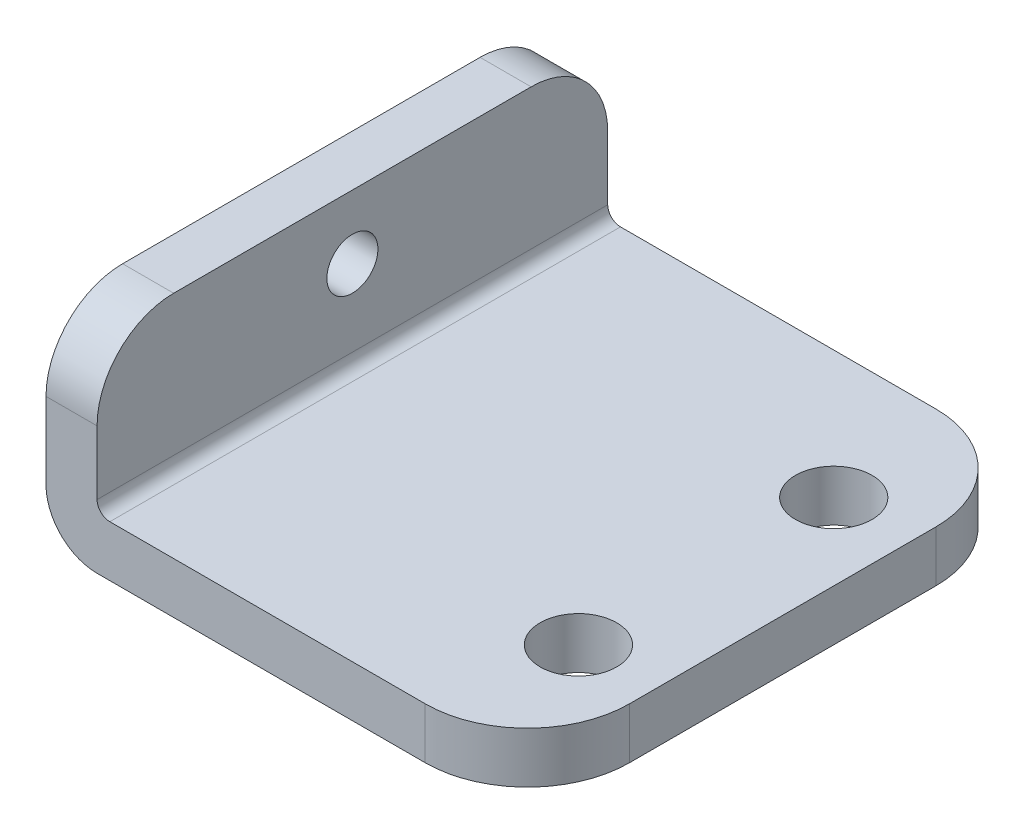
ISO-10303-21;
HEADER;
FILE_DESCRIPTION(('STEP AP214'),'2;1');
FILE_NAME('part.step','',(''),(''),'','','');
FILE_SCHEMA(('AUTOMOTIVE_DESIGN { 1 0 10303 214 1 1 1 1 }'));
ENDSEC;
DATA;
#1=APPLICATION_CONTEXT('core data for automotive mechanical design processes');
#2=APPLICATION_PROTOCOL_DEFINITION('international standard','automotive_design',2000,#1);
#3=PRODUCT_CONTEXT('',#1,'mechanical');
#4=PRODUCT('Part','Part','',(#3));
#5=PRODUCT_RELATED_PRODUCT_CATEGORY('part','',(#4));
#6=PRODUCT_DEFINITION_FORMATION('','',#4);
#7=PRODUCT_DEFINITION_CONTEXT('part definition',#1,'design');
#8=PRODUCT_DEFINITION('design','',#6,#7);
#9=PRODUCT_DEFINITION_SHAPE('','',#8);
#10=(LENGTH_UNIT() NAMED_UNIT(*) SI_UNIT(.MILLI.,.METRE.));
#11=(NAMED_UNIT(*) PLANE_ANGLE_UNIT() SI_UNIT($,.RADIAN.));
#12=(NAMED_UNIT(*) SI_UNIT($,.STERADIAN.) SOLID_ANGLE_UNIT());
#13=UNCERTAINTY_MEASURE_WITH_UNIT(LENGTH_MEASURE(1.E-05),#10,'distance_accuracy_value','');
#14=(GEOMETRIC_REPRESENTATION_CONTEXT(3) GLOBAL_UNCERTAINTY_ASSIGNED_CONTEXT((#13)) GLOBAL_UNIT_ASSIGNED_CONTEXT((#10,
#11,#12)) REPRESENTATION_CONTEXT('',''));
#15=CARTESIAN_POINT('',(0.,0.,0.));
#16=DIRECTION('',(0.,0.,1.));
#17=DIRECTION('',(1.,0.,0.));
#18=AXIS2_PLACEMENT_3D('',#15,#16,#17);
#19=CARTESIAN_POINT('',(8.42639593908629,2.,10.));
#20=DIRECTION('',(-1.,0.,0.));
#21=DIRECTION('',(0.,0.,1.));
#22=AXIS2_PLACEMENT_3D('',#19,#20,#21);
#23=PLANE('',#22);
#24=DIRECTION('',(0.,0.,-1.));
#25=VECTOR('',#24,1.);
#26=CARTESIAN_POINT('',(8.42639593908629,0.,10.));
#27=LINE('',#26,#25);
#28=CARTESIAN_POINT('',(8.42639593908629,0.,6.));
#29=VERTEX_POINT('',#28);
#30=CARTESIAN_POINT('',(8.42639593908629,0.,-6.));
#31=VERTEX_POINT('',#30);
#32=EDGE_CURVE('E152',#29,#31,#27,.T.);
#33=ORIENTED_EDGE('',*,*,#32,.T.);
#34=DIRECTION('',(0.,-1.,0.));
#35=VECTOR('',#34,1.);
#36=CARTESIAN_POINT('',(8.42639593908629,2.,-6.));
#37=LINE('',#36,#35);
#38=CARTESIAN_POINT('',(8.42639593908629,2.,-6.));
#39=VERTEX_POINT('',#38);
#40=EDGE_CURVE('E129',#31,#39,#37,.F.);
#41=ORIENTED_EDGE('',*,*,#40,.T.);
#42=DIRECTION('',(0.,0.,-1.));
#43=VECTOR('',#42,1.);
#44=CARTESIAN_POINT('',(8.42639593908629,2.,10.));
#45=LINE('',#44,#43);
#46=CARTESIAN_POINT('',(8.42639593908629,2.,6.));
#47=VERTEX_POINT('',#46);
#48=EDGE_CURVE('E154',#47,#39,#45,.T.);
#49=ORIENTED_EDGE('',*,*,#48,.F.);
#50=DIRECTION('',(0.,-1.,0.));
#51=VECTOR('',#50,1.);
#52=CARTESIAN_POINT('',(8.42639593908629,2.,6.));
#53=LINE('',#52,#51);
#54=EDGE_CURVE('E134',#47,#29,#53,.T.);
#55=ORIENTED_EDGE('',*,*,#54,.T.);
#56=EDGE_LOOP('',(#33,#41,#49,#55));
#57=FACE_BOUND('',#56,.T.);
#58=ADVANCED_FACE('F36',(#57),#23,.F.);
#59=CARTESIAN_POINT('',(-8.42639593908629,2.,-10.));
#60=DIRECTION('',(0.,0.,1.));
#61=DIRECTION('',(1.,0.,0.));
#62=AXIS2_PLACEMENT_3D('',#59,#60,#61);
#63=PLANE('',#62);
#64=DIRECTION('',(-1.,0.,0.));
#65=VECTOR('',#64,1.);
#66=CARTESIAN_POINT('',(-8.42639593908629,0.,-10.));
#67=LINE('',#66,#65);
#68=CARTESIAN_POINT('',(4.42639593908629,0.,-10.));
#69=VERTEX_POINT('',#68);
#70=CARTESIAN_POINT('',(-8.42639593908629,0.,-10.));
#71=VERTEX_POINT('',#70);
#72=EDGE_CURVE('E141',#69,#71,#67,.T.);
#73=ORIENTED_EDGE('',*,*,#72,.T.);
#74=CARTESIAN_POINT('',(-8.42639593908629,2.,-10.));
#75=DIRECTION('',(0.,0.,1.));
#76=DIRECTION('',(1.,0.,0.));
#77=AXIS2_PLACEMENT_3D('',#74,#75,#76);
#78=CIRCLE('',#77,2.);
#79=CARTESIAN_POINT('',(-10.4263959390863,2.,-10.));
#80=VERTEX_POINT('',#79);
#81=EDGE_CURVE('E198',#71,#80,#78,.F.);
#82=ORIENTED_EDGE('',*,*,#81,.T.);
#83=DIRECTION('',(0.,-1.,0.));
#84=VECTOR('',#83,1.);
#85=CARTESIAN_POINT('',(-10.4263959390863,0.,-10.));
#86=LINE('',#85,#84);
#87=CARTESIAN_POINT('',(-10.4263959390863,5.,-10.));
#88=VERTEX_POINT('',#87);
#89=EDGE_CURVE('E219',#88,#80,#86,.T.);
#90=ORIENTED_EDGE('',*,*,#89,.F.);
#91=DIRECTION('',(1.,0.,0.));
#92=VECTOR('',#91,1.);
#93=CARTESIAN_POINT('',(-8.42639593908629,5.,-10.));
#94=LINE('',#93,#92);
#95=CARTESIAN_POINT('',(-8.42639593908629,5.,-10.));
#96=VERTEX_POINT('',#95);
#97=EDGE_CURVE('E183',#88,#96,#94,.T.);
#98=ORIENTED_EDGE('',*,*,#97,.T.);
#99=DIRECTION('',(0.,-1.,0.));
#100=VECTOR('',#99,1.);
#101=CARTESIAN_POINT('',(-8.42639593908629,0.,-10.));
#102=LINE('',#101,#100);
#103=CARTESIAN_POINT('',(-8.42639593908629,2.5,-10.));
#104=VERTEX_POINT('',#103);
#105=EDGE_CURVE('E222',#96,#104,#102,.T.);
#106=ORIENTED_EDGE('',*,*,#105,.T.);
#107=CARTESIAN_POINT('',(-7.92639593908629,2.5,-10.));
#108=DIRECTION('',(0.,0.,1.));
#109=DIRECTION('',(1.,0.,0.));
#110=AXIS2_PLACEMENT_3D('',#107,#108,#109);
#111=CIRCLE('',#110,0.5);
#112=CARTESIAN_POINT('',(-7.92639593908629,2.,-10.));
#113=VERTEX_POINT('',#112);
#114=EDGE_CURVE('E11',#104,#113,#111,.T.);
#115=ORIENTED_EDGE('',*,*,#114,.T.);
#116=DIRECTION('',(-1.,0.,0.));
#117=VECTOR('',#116,1.);
#118=CARTESIAN_POINT('',(-8.42639593908629,2.,-10.));
#119=LINE('',#118,#117);
#120=CARTESIAN_POINT('',(4.42639593908629,2.,-10.));
#121=VERTEX_POINT('',#120);
#122=EDGE_CURVE('E144',#121,#113,#119,.T.);
#123=ORIENTED_EDGE('',*,*,#122,.F.);
#124=DIRECTION('',(0.,-1.,0.));
#125=VECTOR('',#124,1.);
#126=CARTESIAN_POINT('',(4.42639593908629,2.,-10.));
#127=LINE('',#126,#125);
#128=EDGE_CURVE('E128',#121,#69,#127,.T.);
#129=ORIENTED_EDGE('',*,*,#128,.T.);
#130=EDGE_LOOP('',(#73,#82,#90,#98,#106,#115,#123,#129));
#131=FACE_BOUND('',#130,.T.);
#132=ADVANCED_FACE('F140',(#131),#63,.F.);
#133=CARTESIAN_POINT('',(-8.42639593908629,2.,10.));
#134=DIRECTION('',(0.,0.,-1.));
#135=DIRECTION('',(-1.,0.,0.));
#136=AXIS2_PLACEMENT_3D('',#133,#134,#135);
#137=PLANE('',#136);
#138=DIRECTION('',(0.,1.,0.));
#139=VECTOR('',#138,1.);
#140=CARTESIAN_POINT('',(-10.4263959390863,0.,10.));
#141=LINE('',#140,#139);
#142=CARTESIAN_POINT('',(-10.4263959390863,2.,10.));
#143=VERTEX_POINT('',#142);
#144=CARTESIAN_POINT('',(-10.4263959390863,5.,10.));
#145=VERTEX_POINT('',#144);
#146=EDGE_CURVE('E227',#143,#145,#141,.T.);
#147=ORIENTED_EDGE('',*,*,#146,.F.);
#148=CARTESIAN_POINT('',(-8.42639593908629,2.,10.));
#149=DIRECTION('',(0.,0.,-1.));
#150=DIRECTION('',(-1.,0.,0.));
#151=AXIS2_PLACEMENT_3D('',#148,#149,#150);
#152=CIRCLE('',#151,2.);
#153=CARTESIAN_POINT('',(-8.42639593908629,0.,10.));
#154=VERTEX_POINT('',#153);
#155=EDGE_CURVE('E195',#143,#154,#152,.F.);
#156=ORIENTED_EDGE('',*,*,#155,.T.);
#157=DIRECTION('',(1.,0.,0.));
#158=VECTOR('',#157,1.);
#159=CARTESIAN_POINT('',(-8.42639593908629,0.,10.));
#160=LINE('',#159,#158);
#161=CARTESIAN_POINT('',(4.42639593908629,0.,10.));
#162=VERTEX_POINT('',#161);
#163=EDGE_CURVE('E151',#154,#162,#160,.T.);
#164=ORIENTED_EDGE('',*,*,#163,.T.);
#165=DIRECTION('',(0.,-1.,0.));
#166=VECTOR('',#165,1.);
#167=CARTESIAN_POINT('',(4.42639593908629,2.,10.));
#168=LINE('',#167,#166);
#169=CARTESIAN_POINT('',(4.42639593908629,2.,10.));
#170=VERTEX_POINT('',#169);
#171=EDGE_CURVE('E169',#162,#170,#168,.F.);
#172=ORIENTED_EDGE('',*,*,#171,.T.);
#173=DIRECTION('',(1.,0.,0.));
#174=VECTOR('',#173,1.);
#175=CARTESIAN_POINT('',(-8.42639593908629,2.,10.));
#176=LINE('',#175,#174);
#177=CARTESIAN_POINT('',(-7.92639593908629,2.,10.));
#178=VERTEX_POINT('',#177);
#179=EDGE_CURVE('E145',#178,#170,#176,.T.);
#180=ORIENTED_EDGE('',*,*,#179,.F.);
#181=CARTESIAN_POINT('',(-7.92639593908629,2.5,10.));
#182=DIRECTION('',(0.,0.,-1.));
#183=DIRECTION('',(-1.,0.,0.));
#184=AXIS2_PLACEMENT_3D('',#181,#182,#183);
#185=CIRCLE('',#184,0.5);
#186=CARTESIAN_POINT('',(-8.42639593908629,2.5,10.));
#187=VERTEX_POINT('',#186);
#188=EDGE_CURVE('E44',#178,#187,#185,.T.);
#189=ORIENTED_EDGE('',*,*,#188,.T.);
#190=DIRECTION('',(0.,1.,0.));
#191=VECTOR('',#190,1.);
#192=CARTESIAN_POINT('',(-8.42639593908629,0.,10.));
#193=LINE('',#192,#191);
#194=CARTESIAN_POINT('',(-8.42639593908629,5.,10.));
#195=VERTEX_POINT('',#194);
#196=EDGE_CURVE('E220',#187,#195,#193,.T.);
#197=ORIENTED_EDGE('',*,*,#196,.T.);
#198=DIRECTION('',(1.,0.,0.));
#199=VECTOR('',#198,1.);
#200=CARTESIAN_POINT('',(-8.42639593908629,5.,10.));
#201=LINE('',#200,#199);
#202=EDGE_CURVE('E178',#195,#145,#201,.F.);
#203=ORIENTED_EDGE('',*,*,#202,.T.);
#204=EDGE_LOOP('',(#147,#156,#164,#172,#180,#189,#197,#203));
#205=FACE_BOUND('',#204,.T.);
#206=ADVANCED_FACE('F209',(#205),#137,.F.);
#207=CARTESIAN_POINT('',(0.,2.,0.));
#208=DIRECTION('',(0.,-1.,0.));
#209=DIRECTION('',(0.,0.,-1.));
#210=AXIS2_PLACEMENT_3D('',#207,#208,#209);
#211=PLANE('',#210);
#212=CARTESIAN_POINT('',(5.42639593908629,2.,-5.));
#213=DIRECTION('',(0.,1.,0.));
#214=DIRECTION('',(0.,0.,1.));
#215=AXIS2_PLACEMENT_3D('',#212,#213,#214);
#216=CIRCLE('',#215,1.5);
#217=CARTESIAN_POINT('',(5.42639593908629,2.,-3.5));
#218=VERTEX_POINT('',#217);
#219=EDGE_CURVE('E243',#218,#218,#216,.T.);
#220=ORIENTED_EDGE('',*,*,#219,.F.);
#221=EDGE_LOOP('',(#220));
#222=FACE_BOUND('',#221,.T.);
#223=CARTESIAN_POINT('',(5.42639593908629,2.,5.));
#224=DIRECTION('',(0.,1.,0.));
#225=DIRECTION('',(0.,0.,1.));
#226=AXIS2_PLACEMENT_3D('',#223,#224,#225);
#227=CIRCLE('',#226,1.5);
#228=CARTESIAN_POINT('',(5.42639593908629,2.,6.5));
#229=VERTEX_POINT('',#228);
#230=EDGE_CURVE('E237',#229,#229,#227,.T.);
#231=ORIENTED_EDGE('',*,*,#230,.F.);
#232=EDGE_LOOP('',(#231));
#233=FACE_BOUND('',#232,.T.);
#234=ORIENTED_EDGE('',*,*,#122,.T.);
#235=DIRECTION('',(0.,0.,1.));
#236=VECTOR('',#235,1.);
#237=CARTESIAN_POINT('',(-7.92639593908629,2.,0.));
#238=LINE('',#237,#236);
#239=EDGE_CURVE('E200',#113,#178,#238,.T.);
#240=ORIENTED_EDGE('',*,*,#239,.T.);
#241=ORIENTED_EDGE('',*,*,#179,.T.);
#242=CARTESIAN_POINT('',(4.42639593908629,2.,6.));
#243=DIRECTION('',(0.,-1.,0.));
#244=DIRECTION('',(0.,0.,-1.));
#245=AXIS2_PLACEMENT_3D('',#242,#243,#244);
#246=CIRCLE('',#245,4.);
#247=EDGE_CURVE('E165',#170,#47,#246,.F.);
#248=ORIENTED_EDGE('',*,*,#247,.T.);
#249=ORIENTED_EDGE('',*,*,#48,.T.);
#250=CARTESIAN_POINT('',(4.42639593908629,2.,-6.));
#251=DIRECTION('',(0.,-1.,0.));
#252=DIRECTION('',(0.,0.,-1.));
#253=AXIS2_PLACEMENT_3D('',#250,#251,#252);
#254=CIRCLE('',#253,4.);
#255=EDGE_CURVE('E167',#39,#121,#254,.F.);
#256=ORIENTED_EDGE('',*,*,#255,.T.);
#257=EDGE_LOOP('',(#234,#240,#241,#248,#249,#256));
#258=FACE_BOUND('',#257,.T.);
#259=ADVANCED_FACE('F205',(#222,#233,#258),#211,.F.);
#260=CARTESIAN_POINT('',(0.,0.,0.));
#261=DIRECTION('',(0.,-1.,0.));
#262=DIRECTION('',(0.,0.,-1.));
#263=AXIS2_PLACEMENT_3D('',#260,#261,#262);
#264=PLANE('',#263);
#265=CARTESIAN_POINT('',(5.42639593908629,0.,-5.));
#266=DIRECTION('',(0.,1.,0.));
#267=DIRECTION('',(0.,0.,1.));
#268=AXIS2_PLACEMENT_3D('',#265,#266,#267);
#269=CIRCLE('',#268,1.5);
#270=CARTESIAN_POINT('',(5.42639593908629,0.,-3.5));
#271=VERTEX_POINT('',#270);
#272=EDGE_CURVE('E234',#271,#271,#269,.T.);
#273=ORIENTED_EDGE('',*,*,#272,.T.);
#274=EDGE_LOOP('',(#273));
#275=FACE_BOUND('',#274,.T.);
#276=CARTESIAN_POINT('',(5.42639593908629,0.,5.));
#277=DIRECTION('',(0.,1.,0.));
#278=DIRECTION('',(0.,0.,1.));
#279=AXIS2_PLACEMENT_3D('',#276,#277,#278);
#280=CIRCLE('',#279,1.5);
#281=CARTESIAN_POINT('',(5.42639593908629,0.,6.5));
#282=VERTEX_POINT('',#281);
#283=EDGE_CURVE('E240',#282,#282,#280,.T.);
#284=ORIENTED_EDGE('',*,*,#283,.T.);
#285=EDGE_LOOP('',(#284));
#286=FACE_BOUND('',#285,.T.);
#287=ORIENTED_EDGE('',*,*,#163,.F.);
#288=DIRECTION('',(0.,0.,1.));
#289=VECTOR('',#288,1.);
#290=CARTESIAN_POINT('',(-8.42639593908629,0.,-10.));
#291=LINE('',#290,#289);
#292=EDGE_CURVE('E150',#154,#71,#291,.F.);
#293=ORIENTED_EDGE('',*,*,#292,.T.);
#294=ORIENTED_EDGE('',*,*,#72,.F.);
#295=CARTESIAN_POINT('',(4.42639593908629,0.,-6.));
#296=DIRECTION('',(0.,-1.,0.));
#297=DIRECTION('',(0.,0.,-1.));
#298=AXIS2_PLACEMENT_3D('',#295,#296,#297);
#299=CIRCLE('',#298,4.);
#300=EDGE_CURVE('E124',#69,#31,#299,.T.);
#301=ORIENTED_EDGE('',*,*,#300,.T.);
#302=ORIENTED_EDGE('',*,*,#32,.F.);
#303=CARTESIAN_POINT('',(4.42639593908629,0.,6.));
#304=DIRECTION('',(0.,-1.,0.));
#305=DIRECTION('',(0.,0.,-1.));
#306=AXIS2_PLACEMENT_3D('',#303,#304,#305);
#307=CIRCLE('',#306,4.);
#308=EDGE_CURVE('E135',#29,#162,#307,.T.);
#309=ORIENTED_EDGE('',*,*,#308,.T.);
#310=EDGE_LOOP('',(#287,#293,#294,#301,#302,#309));
#311=FACE_BOUND('',#310,.T.);
#312=ADVANCED_FACE('F148',(#275,#286,#311),#264,.T.);
#313=CARTESIAN_POINT('',(4.42639593908629,2.,-6.));
#314=DIRECTION('',(0.,-1.,0.));
#315=DIRECTION('',(0.,0.,-1.));
#316=AXIS2_PLACEMENT_3D('',#313,#314,#315);
#317=CYLINDRICAL_SURFACE('',#316,4.);
#318=ORIENTED_EDGE('',*,*,#255,.F.);
#319=ORIENTED_EDGE('',*,*,#40,.F.);
#320=ORIENTED_EDGE('',*,*,#300,.F.);
#321=ORIENTED_EDGE('',*,*,#128,.F.);
#322=EDGE_LOOP('',(#318,#319,#320,#321));
#323=FACE_BOUND('',#322,.T.);
#324=ADVANCED_FACE('F127',(#323),#317,.T.);
#325=CARTESIAN_POINT('',(4.42639593908629,2.,6.));
#326=DIRECTION('',(0.,-1.,0.));
#327=DIRECTION('',(0.,0.,-1.));
#328=AXIS2_PLACEMENT_3D('',#325,#326,#327);
#329=CYLINDRICAL_SURFACE('',#328,4.);
#330=ORIENTED_EDGE('',*,*,#247,.F.);
#331=ORIENTED_EDGE('',*,*,#171,.F.);
#332=ORIENTED_EDGE('',*,*,#308,.F.);
#333=ORIENTED_EDGE('',*,*,#54,.F.);
#334=EDGE_LOOP('',(#330,#331,#332,#333));
#335=FACE_BOUND('',#334,.T.);
#336=ADVANCED_FACE('F283',(#335),#329,.T.);
#337=CARTESIAN_POINT('',(-8.42639593908629,0.,0.));
#338=DIRECTION('',(1.,0.,0.));
#339=DIRECTION('',(0.,0.,-1.));
#340=AXIS2_PLACEMENT_3D('',#337,#338,#339);
#341=PLANE('',#340);
#342=CARTESIAN_POINT('',(-8.42639593908629,5.5,0.));
#343=DIRECTION('',(-1.,0.,0.));
#344=DIRECTION('',(0.,0.,1.));
#345=AXIS2_PLACEMENT_3D('',#342,#343,#344);
#346=CIRCLE('',#345,1.);
#347=CARTESIAN_POINT('',(-8.42639593908629,5.5,0.999999999999999));
#348=VERTEX_POINT('',#347);
#349=EDGE_CURVE('E231',#348,#348,#346,.T.);
#350=ORIENTED_EDGE('',*,*,#349,.T.);
#351=EDGE_LOOP('',(#350));
#352=FACE_BOUND('',#351,.T.);
#353=ORIENTED_EDGE('',*,*,#196,.F.);
#354=DIRECTION('',(0.,0.,1.));
#355=VECTOR('',#354,1.);
#356=CARTESIAN_POINT('',(-8.42639593908629,2.5,0.));
#357=LINE('',#356,#355);
#358=EDGE_CURVE('E57',#187,#104,#357,.F.);
#359=ORIENTED_EDGE('',*,*,#358,.T.);
#360=ORIENTED_EDGE('',*,*,#105,.F.);
#361=CARTESIAN_POINT('',(-8.42639593908629,5.,-7.));
#362=DIRECTION('',(1.,0.,0.));
#363=DIRECTION('',(0.,0.,-1.));
#364=AXIS2_PLACEMENT_3D('',#361,#362,#363);
#365=CIRCLE('',#364,3.);
#366=CARTESIAN_POINT('',(-8.42639593908629,8.,-7.));
#367=VERTEX_POINT('',#366);
#368=EDGE_CURVE('E186',#96,#367,#365,.T.);
#369=ORIENTED_EDGE('',*,*,#368,.T.);
#370=DIRECTION('',(0.,0.,-1.));
#371=VECTOR('',#370,1.);
#372=CARTESIAN_POINT('',(-8.42639593908629,8.,-10.));
#373=LINE('',#372,#371);
#374=CARTESIAN_POINT('',(-8.42639593908629,8.,7.));
#375=VERTEX_POINT('',#374);
#376=EDGE_CURVE('E216',#375,#367,#373,.T.);
#377=ORIENTED_EDGE('',*,*,#376,.F.);
#378=CARTESIAN_POINT('',(-8.42639593908629,5.,7.));
#379=DIRECTION('',(1.,0.,0.));
#380=DIRECTION('',(0.,0.,-1.));
#381=AXIS2_PLACEMENT_3D('',#378,#379,#380);
#382=CIRCLE('',#381,3.);
#383=EDGE_CURVE('E175',#375,#195,#382,.T.);
#384=ORIENTED_EDGE('',*,*,#383,.T.);
#385=EDGE_LOOP('',(#353,#359,#360,#369,#377,#384));
#386=FACE_BOUND('',#385,.T.);
#387=ADVANCED_FACE('F286',(#352,#386),#341,.T.);
#388=CARTESIAN_POINT('',(-10.4263959390863,0.,0.));
#389=DIRECTION('',(1.,0.,0.));
#390=DIRECTION('',(0.,0.,-1.));
#391=AXIS2_PLACEMENT_3D('',#388,#389,#390);
#392=PLANE('',#391);
#393=ORIENTED_EDGE('',*,*,#89,.T.);
#394=DIRECTION('',(0.,0.,1.));
#395=VECTOR('',#394,1.);
#396=CARTESIAN_POINT('',(-10.4263959390863,2.,10.));
#397=LINE('',#396,#395);
#398=EDGE_CURVE('E192',#80,#143,#397,.T.);
#399=ORIENTED_EDGE('',*,*,#398,.T.);
#400=ORIENTED_EDGE('',*,*,#146,.T.);
#401=CARTESIAN_POINT('',(-10.4263959390863,5.,7.));
#402=DIRECTION('',(1.,0.,0.));
#403=DIRECTION('',(0.,0.,-1.));
#404=AXIS2_PLACEMENT_3D('',#401,#402,#403);
#405=CIRCLE('',#404,3.);
#406=CARTESIAN_POINT('',(-10.4263959390863,8.,7.));
#407=VERTEX_POINT('',#406);
#408=EDGE_CURVE('E181',#145,#407,#405,.F.);
#409=ORIENTED_EDGE('',*,*,#408,.T.);
#410=DIRECTION('',(0.,0.,-1.));
#411=VECTOR('',#410,1.);
#412=CARTESIAN_POINT('',(-10.4263959390863,8.,-10.));
#413=LINE('',#412,#411);
#414=CARTESIAN_POINT('',(-10.4263959390863,8.,-7.));
#415=VERTEX_POINT('',#414);
#416=EDGE_CURVE('E156',#407,#415,#413,.T.);
#417=ORIENTED_EDGE('',*,*,#416,.T.);
#418=CARTESIAN_POINT('',(-10.4263959390863,5.,-7.));
#419=DIRECTION('',(1.,0.,0.));
#420=DIRECTION('',(0.,0.,-1.));
#421=AXIS2_PLACEMENT_3D('',#418,#419,#420);
#422=CIRCLE('',#421,3.);
#423=EDGE_CURVE('E190',#415,#88,#422,.F.);
#424=ORIENTED_EDGE('',*,*,#423,.T.);
#425=EDGE_LOOP('',(#393,#399,#400,#409,#417,#424));
#426=FACE_BOUND('',#425,.T.);
#427=CARTESIAN_POINT('',(-10.4263959390863,5.5,0.));
#428=DIRECTION('',(-1.,0.,0.));
#429=DIRECTION('',(0.,0.,1.));
#430=AXIS2_PLACEMENT_3D('',#427,#428,#429);
#431=CIRCLE('',#430,1.);
#432=CARTESIAN_POINT('',(-10.4263959390863,5.5,0.999999999999999));
#433=VERTEX_POINT('',#432);
#434=EDGE_CURVE('E224',#433,#433,#431,.T.);
#435=ORIENTED_EDGE('',*,*,#434,.F.);
#436=EDGE_LOOP('',(#435));
#437=FACE_BOUND('',#436,.T.);
#438=ADVANCED_FACE('F304',(#426,#437),#392,.F.);
#439=CARTESIAN_POINT('',(-10.4263959390863,8.,-10.));
#440=DIRECTION('',(0.,-1.,0.));
#441=DIRECTION('',(0.,0.,-1.));
#442=AXIS2_PLACEMENT_3D('',#439,#440,#441);
#443=PLANE('',#442);
#444=ORIENTED_EDGE('',*,*,#376,.T.);
#445=DIRECTION('',(1.,0.,0.));
#446=VECTOR('',#445,1.);
#447=CARTESIAN_POINT('',(-10.4263959390863,8.,-7.));
#448=LINE('',#447,#446);
#449=EDGE_CURVE('E188',#367,#415,#448,.F.);
#450=ORIENTED_EDGE('',*,*,#449,.T.);
#451=ORIENTED_EDGE('',*,*,#416,.F.);
#452=DIRECTION('',(1.,0.,0.));
#453=VECTOR('',#452,1.);
#454=CARTESIAN_POINT('',(-10.4263959390863,8.,7.));
#455=LINE('',#454,#453);
#456=EDGE_CURVE('E172',#407,#375,#455,.T.);
#457=ORIENTED_EDGE('',*,*,#456,.T.);
#458=EDGE_LOOP('',(#444,#450,#451,#457));
#459=FACE_BOUND('',#458,.T.);
#460=ADVANCED_FACE('F311',(#459),#443,.F.);
#461=CARTESIAN_POINT('',(-10.4263959390863,5.5,0.));
#462=DIRECTION('',(1.,0.,0.));
#463=DIRECTION('',(0.,0.,-1.));
#464=AXIS2_PLACEMENT_3D('',#461,#462,#463);
#465=CYLINDRICAL_SURFACE('',#464,1.);
#466=ORIENTED_EDGE('',*,*,#434,.T.);
#467=EDGE_LOOP('',(#466));
#468=FACE_BOUND('',#467,.T.);
#469=ORIENTED_EDGE('',*,*,#349,.F.);
#470=EDGE_LOOP('',(#469));
#471=FACE_BOUND('',#470,.T.);
#472=ADVANCED_FACE('F292',(#468,#471),#465,.F.);
#473=CARTESIAN_POINT('',(-10.4263959390863,5.,7.));
#474=DIRECTION('',(1.,0.,0.));
#475=DIRECTION('',(0.,0.,-1.));
#476=AXIS2_PLACEMENT_3D('',#473,#474,#475);
#477=CYLINDRICAL_SURFACE('',#476,3.);
#478=ORIENTED_EDGE('',*,*,#408,.F.);
#479=ORIENTED_EDGE('',*,*,#202,.F.);
#480=ORIENTED_EDGE('',*,*,#383,.F.);
#481=ORIENTED_EDGE('',*,*,#456,.F.);
#482=EDGE_LOOP('',(#478,#479,#480,#481));
#483=FACE_BOUND('',#482,.T.);
#484=ADVANCED_FACE('F288',(#483),#477,.T.);
#485=CARTESIAN_POINT('',(-8.42639593908629,5.,-7.));
#486=DIRECTION('',(1.,0.,0.));
#487=DIRECTION('',(0.,0.,-1.));
#488=AXIS2_PLACEMENT_3D('',#485,#486,#487);
#489=CYLINDRICAL_SURFACE('',#488,3.);
#490=ORIENTED_EDGE('',*,*,#423,.F.);
#491=ORIENTED_EDGE('',*,*,#449,.F.);
#492=ORIENTED_EDGE('',*,*,#368,.F.);
#493=ORIENTED_EDGE('',*,*,#97,.F.);
#494=EDGE_LOOP('',(#490,#491,#492,#493));
#495=FACE_BOUND('',#494,.T.);
#496=ADVANCED_FACE('F291',(#495),#489,.T.);
#497=CARTESIAN_POINT('',(-8.42639593908629,2.,0.));
#498=DIRECTION('',(0.,0.,-1.));
#499=DIRECTION('',(-1.,0.,0.));
#500=AXIS2_PLACEMENT_3D('',#497,#498,#499);
#501=CYLINDRICAL_SURFACE('',#500,2.);
#502=ORIENTED_EDGE('',*,*,#81,.F.);
#503=ORIENTED_EDGE('',*,*,#292,.F.);
#504=ORIENTED_EDGE('',*,*,#155,.F.);
#505=ORIENTED_EDGE('',*,*,#398,.F.);
#506=EDGE_LOOP('',(#502,#503,#504,#505));
#507=FACE_BOUND('',#506,.T.);
#508=ADVANCED_FACE('F269',(#507),#501,.T.);
#509=CARTESIAN_POINT('',(-7.92639593908629,2.5,0.));
#510=DIRECTION('',(0.,0.,1.));
#511=DIRECTION('',(1.,0.,0.));
#512=AXIS2_PLACEMENT_3D('',#509,#510,#511);
#513=CYLINDRICAL_SURFACE('',#512,0.5);
#514=ORIENTED_EDGE('',*,*,#114,.F.);
#515=ORIENTED_EDGE('',*,*,#358,.F.);
#516=ORIENTED_EDGE('',*,*,#188,.F.);
#517=ORIENTED_EDGE('',*,*,#239,.F.);
#518=EDGE_LOOP('',(#514,#515,#516,#517));
#519=FACE_BOUND('',#518,.T.);
#520=ADVANCED_FACE('F38',(#519),#513,.F.);
#521=CARTESIAN_POINT('',(5.42639593908629,0.,5.));
#522=DIRECTION('',(0.,1.,0.));
#523=DIRECTION('',(0.,0.,1.));
#524=AXIS2_PLACEMENT_3D('',#521,#522,#523);
#525=CYLINDRICAL_SURFACE('',#524,1.5);
#526=ORIENTED_EDGE('',*,*,#283,.F.);
#527=EDGE_LOOP('',(#526));
#528=FACE_BOUND('',#527,.T.);
#529=ORIENTED_EDGE('',*,*,#230,.T.);
#530=EDGE_LOOP('',(#529));
#531=FACE_BOUND('',#530,.T.);
#532=ADVANCED_FACE('F254',(#528,#531),#525,.F.);
#533=CARTESIAN_POINT('',(5.42639593908629,0.,-5.));
#534=DIRECTION('',(0.,1.,0.));
#535=DIRECTION('',(0.,0.,1.));
#536=AXIS2_PLACEMENT_3D('',#533,#534,#535);
#537=CYLINDRICAL_SURFACE('',#536,1.5);
#538=ORIENTED_EDGE('',*,*,#272,.F.);
#539=EDGE_LOOP('',(#538));
#540=FACE_BOUND('',#539,.T.);
#541=ORIENTED_EDGE('',*,*,#219,.T.);
#542=EDGE_LOOP('',(#541));
#543=FACE_BOUND('',#542,.T.);
#544=ADVANCED_FACE('F251',(#540,#543),#537,.F.);
#545=CLOSED_SHELL('',(#58,#132,#206,#259,#312,#324,#336,#387,#438,#460,#472,#484,#496,#508,#520,
#532,#544));
#546=MANIFOLD_SOLID_BREP('B2',#545);
#547=ADVANCED_BREP_SHAPE_REPRESENTATION('',(#18,#546),#14);
#548=SHAPE_DEFINITION_REPRESENTATION(#9,#547);
ENDSEC;
END-ISO-10303-21;
